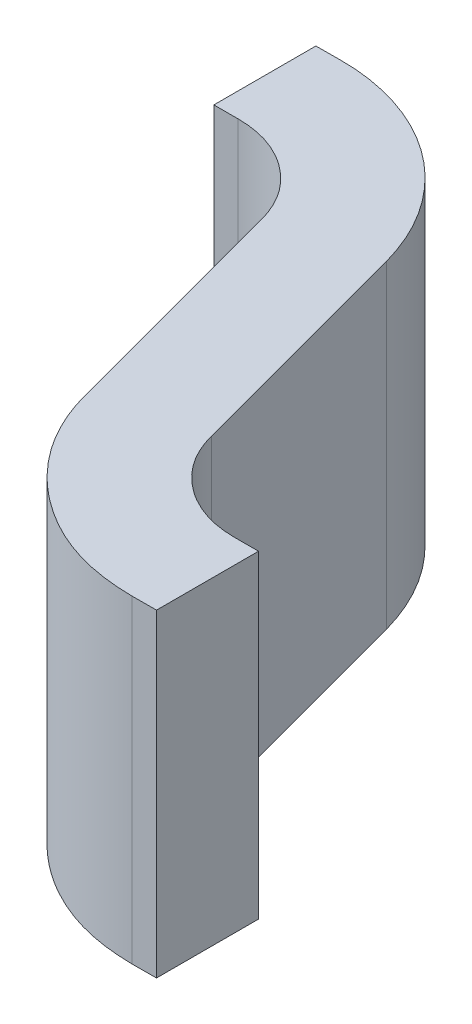
ISO-10303-21;
HEADER;
FILE_DESCRIPTION(('STEP AP214'),'2;1');
FILE_NAME('part.step','',(''),(''),'','','');
FILE_SCHEMA(('AUTOMOTIVE_DESIGN { 1 0 10303 214 1 1 1 1 }'));
ENDSEC;
DATA;
#1=APPLICATION_CONTEXT('core data for automotive mechanical design processes');
#2=APPLICATION_PROTOCOL_DEFINITION('international standard','automotive_design',2000,#1);
#3=PRODUCT_CONTEXT('',#1,'mechanical');
#4=PRODUCT('Part','Part','',(#3));
#5=PRODUCT_RELATED_PRODUCT_CATEGORY('part','',(#4));
#6=PRODUCT_DEFINITION_FORMATION('','',#4);
#7=PRODUCT_DEFINITION_CONTEXT('part definition',#1,'design');
#8=PRODUCT_DEFINITION('design','',#6,#7);
#9=PRODUCT_DEFINITION_SHAPE('','',#8);
#10=(LENGTH_UNIT() NAMED_UNIT(*) SI_UNIT(.MILLI.,.METRE.));
#11=(NAMED_UNIT(*) PLANE_ANGLE_UNIT() SI_UNIT($,.RADIAN.));
#12=(NAMED_UNIT(*) SI_UNIT($,.STERADIAN.) SOLID_ANGLE_UNIT());
#13=UNCERTAINTY_MEASURE_WITH_UNIT(LENGTH_MEASURE(1.E-05),#10,'distance_accuracy_value','');
#14=(GEOMETRIC_REPRESENTATION_CONTEXT(3) GLOBAL_UNCERTAINTY_ASSIGNED_CONTEXT((#13)) GLOBAL_UNIT_ASSIGNED_CONTEXT((#10,
#11,#12)) REPRESENTATION_CONTEXT('',''));
#15=CARTESIAN_POINT('',(0.,0.,0.));
#16=DIRECTION('',(0.,0.,1.));
#17=DIRECTION('',(1.,0.,0.));
#18=AXIS2_PLACEMENT_3D('',#15,#16,#17);
#19=CARTESIAN_POINT('',(-0.673,0.203,0.594));
#20=DIRECTION('',(0.,0.,-1.));
#21=DIRECTION('',(-1.,0.,0.));
#22=AXIS2_PLACEMENT_3D('',#19,#20,#21);
#23=PLANE('',#22);
#24=CARTESIAN_POINT('',(-0.704,-0.203,0.594));
#25=DIRECTION('',(0.,1.,0.));
#26=VECTOR('',#25,1.);
#27=LINE('',#24,#26);
#28=CARTESIAN_POINT('',(-0.704,-0.203,0.5940875));
#29=VERTEX_POINT('',#28);
#30=CARTESIAN_POINT('',(-0.704,0.203,0.5940875));
#31=VERTEX_POINT('',#30);
#32=EDGE_CURVE('E120',#29,#31,#27,.T.);
#33=ORIENTED_EDGE('',*,*,#32,.T.);
#34=DIRECTION('',(1.,0.,0.));
#35=VECTOR('',#34,1.);
#36=CARTESIAN_POINT('',(-0.673,0.203,0.594));
#37=LINE('',#36,#35);
#38=CARTESIAN_POINT('',(-0.673,0.203,0.594));
#39=VERTEX_POINT('',#38);
#40=EDGE_CURVE('E118',#39,#31,#37,.F.);
#41=ORIENTED_EDGE('',*,*,#40,.F.);
#42=DIRECTION('',(0.,1.,0.));
#43=VECTOR('',#42,1.);
#44=CARTESIAN_POINT('',(-0.673,-0.203,0.594));
#45=LINE('',#44,#43);
#46=CARTESIAN_POINT('',(-0.673,-0.203,0.594));
#47=VERTEX_POINT('',#46);
#48=EDGE_CURVE('E105',#47,#39,#45,.T.);
#49=ORIENTED_EDGE('',*,*,#48,.F.);
#50=DIRECTION('',(1.,0.,0.));
#51=VECTOR('',#50,1.);
#52=CARTESIAN_POINT('',(-1.163,-0.203,0.594));
#53=LINE('',#52,#51);
#54=EDGE_CURVE('E231',#29,#47,#53,.T.);
#55=ORIENTED_EDGE('',*,*,#54,.F.);
#56=EDGE_LOOP('',(#33,#41,#49,#55));
#57=FACE_BOUND('',#56,.T.);
#58=ADVANCED_FACE('F17',(#57),#23,.T.);
#59=CARTESIAN_POINT('',(-0.673,-0.203,0.594));
#60=DIRECTION('',(1.,0.,0.));
#61=DIRECTION('',(0.,0.,-1.));
#62=AXIS2_PLACEMENT_3D('',#59,#60,#61);
#63=PLANE('',#62);
#64=DIRECTION('',(0.,1.,0.));
#65=VECTOR('',#64,1.);
#66=CARTESIAN_POINT('',(-0.673,-0.203,0.724));
#67=LINE('',#66,#65);
#68=CARTESIAN_POINT('',(-0.673,-0.203,0.724));
#69=VERTEX_POINT('',#68);
#70=CARTESIAN_POINT('',(-0.673,0.203,0.724));
#71=VERTEX_POINT('',#70);
#72=EDGE_CURVE('E115',#69,#71,#67,.T.);
#73=ORIENTED_EDGE('',*,*,#72,.F.);
#74=DIRECTION('',(0.,0.,-1.));
#75=VECTOR('',#74,1.);
#76=CARTESIAN_POINT('',(-0.673,-0.203,0.13));
#77=LINE('',#76,#75);
#78=EDGE_CURVE('E112',#47,#69,#77,.F.);
#79=ORIENTED_EDGE('',*,*,#78,.F.);
#80=ORIENTED_EDGE('',*,*,#48,.T.);
#81=DIRECTION('',(0.,0.,1.));
#82=VECTOR('',#81,1.);
#83=CARTESIAN_POINT('',(-0.673,0.203,0.594));
#84=LINE('',#83,#82);
#85=EDGE_CURVE('E109',#71,#39,#84,.F.);
#86=ORIENTED_EDGE('',*,*,#85,.F.);
#87=EDGE_LOOP('',(#73,#79,#80,#86));
#88=FACE_BOUND('',#87,.T.);
#89=ADVANCED_FACE('F107',(#88),#63,.T.);
#90=CARTESIAN_POINT('',(-0.673,-0.203,0.724));
#91=DIRECTION('',(0.,0.,1.));
#92=DIRECTION('',(1.,0.,0.));
#93=AXIS2_PLACEMENT_3D('',#90,#91,#92);
#94=PLANE('',#93);
#95=CARTESIAN_POINT('',(-0.704,-0.203,0.72435));
#96=DIRECTION('',(0.,1.,0.));
#97=VECTOR('',#96,1.);
#98=LINE('',#95,#97);
#99=CARTESIAN_POINT('',(-0.704,-0.203,0.724175));
#100=VERTEX_POINT('',#99);
#101=CARTESIAN_POINT('',(-0.704,0.203,0.724175));
#102=VERTEX_POINT('',#101);
#103=EDGE_CURVE('E235',#100,#102,#98,.T.);
#104=ORIENTED_EDGE('',*,*,#103,.F.);
#105=DIRECTION('',(1.,0.,0.));
#106=VECTOR('',#105,1.);
#107=CARTESIAN_POINT('',(-1.163,-0.203,0.724));
#108=LINE('',#107,#106);
#109=EDGE_CURVE('E230',#69,#100,#108,.F.);
#110=ORIENTED_EDGE('',*,*,#109,.F.);
#111=ORIENTED_EDGE('',*,*,#72,.T.);
#112=DIRECTION('',(1.,0.,0.));
#113=VECTOR('',#112,1.);
#114=CARTESIAN_POINT('',(-0.673,0.203,0.724));
#115=LINE('',#114,#113);
#116=EDGE_CURVE('E129',#102,#71,#115,.T.);
#117=ORIENTED_EDGE('',*,*,#116,.F.);
#118=EDGE_LOOP('',(#104,#110,#111,#117));
#119=FACE_BOUND('',#118,.T.);
#120=ADVANCED_FACE('F253',(#119),#94,.T.);
#121=CARTESIAN_POINT('',(-0.704,-0.203,0.464));
#122=DIRECTION('',(0.,-1.,0.));
#123=DIRECTION('',(0.,0.,-1.));
#124=AXIS2_PLACEMENT_3D('',#121,#122,#123);
#125=CYLINDRICAL_SURFACE('',#124,0.26035);
#126=CARTESIAN_POINT('',(-0.955526772155082,-0.203,0.530873120070566));
#127=DIRECTION('',(0.,1.,0.));
#128=VECTOR('',#127,1.);
#129=LINE('',#126,#128);
#130=CARTESIAN_POINT('',(-0.955778048925911,-0.203,0.530940647970098));
#131=VERTEX_POINT('',#130);
#132=CARTESIAN_POINT('',(-0.955778048925911,0.203,0.530940647970098));
#133=VERTEX_POINT('',#132);
#134=EDGE_CURVE('E299',#131,#133,#129,.T.);
#135=ORIENTED_EDGE('',*,*,#134,.F.);
#136=CARTESIAN_POINT('',(-0.704,-0.203,0.724));
#137=CARTESIAN_POINT('',(-0.791951894894089,-0.203,0.724153781472785));
#138=CARTESIAN_POINT('',(-0.862800194597106,-0.203,0.670327244359175));
#139=CARTESIAN_POINT('',(-0.932937770329666,-0.203,0.617040675181758));
#140=CARTESIAN_POINT('',(-0.956,-0.203,0.531));
#141=B_SPLINE_CURVE_WITH_KNOTS('',2,(#136,#137,#138,#139,#140),.UNSPECIFIED.,.F.,.F.,(3,2,3),
(0.,0.5,1.),.UNSPECIFIED.);
#142=EDGE_CURVE('E301',#100,#131,#141,.T.);
#143=ORIENTED_EDGE('',*,*,#142,.F.);
#144=ORIENTED_EDGE('',*,*,#103,.T.);
#145=CARTESIAN_POINT('',(-0.956,0.203,0.531));
#146=CARTESIAN_POINT('',(-0.933229234488758,0.203,0.6159532793229));
#147=CARTESIAN_POINT('',(-0.862800194597106,0.203,0.670327244359175));
#148=CARTESIAN_POINT('',(-0.793077672816363,0.203,0.724155749864565));
#149=CARTESIAN_POINT('',(-0.704,0.203,0.724));
#150=B_SPLINE_CURVE_WITH_KNOTS('',2,(#145,#146,#147,#148,#149),.UNSPECIFIED.,.F.,.F.,(3,2,3),
(0.,0.5,1.),.UNSPECIFIED.);
#151=EDGE_CURVE('E457',#133,#102,#150,.T.);
#152=ORIENTED_EDGE('',*,*,#151,.F.);
#153=EDGE_LOOP('',(#135,#143,#144,#152));
#154=FACE_BOUND('',#153,.T.);
#155=ADVANCED_FACE('F242',(#154),#125,.T.);
#156=CARTESIAN_POINT('',(-1.037,0.203,0.227));
#157=DIRECTION('',(-0.965885549343273,0.,0.258969313954073));
#158=DIRECTION('',(0.258969313954073,0.,0.965885549343273));
#159=AXIS2_PLACEMENT_3D('',#156,#157,#158);
#160=PLANE('',#159);
#161=ORIENTED_EDGE('',*,*,#134,.T.);
#162=CARTESIAN_POINT('',(-1.037,0.203,0.227));
#163=DIRECTION('',(0.257464808361809,0.,0.966287675827037));
#164=VECTOR('',#163,1.);
#165=LINE('',#162,#164);
#166=CARTESIAN_POINT('',(-1.03703616041074,0.203,0.227009470583765));
#167=VERTEX_POINT('',#166);
#168=EDGE_CURVE('E455',#167,#133,#165,.T.);
#169=ORIENTED_EDGE('',*,*,#168,.F.);
#170=CARTESIAN_POINT('',(-1.037,0.203,0.227));
#171=DIRECTION('',(0.,-1.,0.));
#172=VECTOR('',#171,1.);
#173=LINE('',#170,#172);
#174=CARTESIAN_POINT('',(-1.03703616041074,-0.203,0.227009470583765));
#175=VERTEX_POINT('',#174);
#176=EDGE_CURVE('E429',#167,#175,#173,.T.);
#177=ORIENTED_EDGE('',*,*,#176,.T.);
#178=CARTESIAN_POINT('',(-0.956,-0.203,0.531));
#179=DIRECTION('',(-0.257464808361809,0.,-0.966287675827037));
#180=VECTOR('',#179,1.);
#181=LINE('',#178,#180);
#182=EDGE_CURVE('E306',#131,#175,#181,.T.);
#183=ORIENTED_EDGE('',*,*,#182,.F.);
#184=EDGE_LOOP('',(#161,#169,#177,#183));
#185=FACE_BOUND('',#184,.T.);
#186=ADVANCED_FACE('F252',(#185),#160,.T.);
#187=CARTESIAN_POINT('',(-1.163,0.203,0.26));
#188=DIRECTION('',(0.,-1.,0.));
#189=DIRECTION('',(0.,0.,-1.));
#190=AXIS2_PLACEMENT_3D('',#187,#188,#189);
#191=CYLINDRICAL_SURFACE('',#190,0.130175);
#192=CARTESIAN_POINT('',(-1.037,-0.203,0.227));
#193=CARTESIAN_POINT('',(-1.04820734245524,-0.203,0.184337873813478));
#194=CARTESIAN_POINT('',(-1.0834429661774,-0.203,0.156992982158839));
#195=CARTESIAN_POINT('',(-1.11832539944349,-0.203,0.129922186823055));
#196=CARTESIAN_POINT('',(-1.163,-0.203,0.13));
#197=B_SPLINE_CURVE_WITH_KNOTS('',2,(#192,#193,#194,#195,#196),.UNSPECIFIED.,.F.,.F.,(3,2,3),
(0.,0.5,1.),.UNSPECIFIED.);
#198=CARTESIAN_POINT('',(-1.163,-0.203,0.1299125));
#199=VERTEX_POINT('',#198);
#200=EDGE_CURVE('E369',#175,#199,#197,.T.);
#201=ORIENTED_EDGE('',*,*,#200,.F.);
#202=ORIENTED_EDGE('',*,*,#176,.F.);
#203=CARTESIAN_POINT('',(-1.163,0.203,0.13));
#204=CARTESIAN_POINT('',(-1.11889035866824,0.203,0.129923170855851));
#205=CARTESIAN_POINT('',(-1.0834429661774,0.203,0.156992982158839));
#206=CARTESIAN_POINT('',(-1.04835088684404,0.203,0.183791454459135));
#207=CARTESIAN_POINT('',(-1.037,0.203,0.227));
#208=B_SPLINE_CURVE_WITH_KNOTS('',2,(#203,#204,#205,#206,#207),.UNSPECIFIED.,.F.,.F.,(3,2,3),
(0.,0.5,1.),.UNSPECIFIED.);
#209=CARTESIAN_POINT('',(-1.163,0.203,0.1299125));
#210=VERTEX_POINT('',#209);
#211=EDGE_CURVE('E461',#210,#167,#208,.T.);
#212=ORIENTED_EDGE('',*,*,#211,.F.);
#213=CARTESIAN_POINT('',(-1.163,-0.203,0.13));
#214=DIRECTION('',(0.,1.,0.));
#215=VECTOR('',#214,1.);
#216=LINE('',#213,#215);
#217=EDGE_CURVE('E474',#199,#210,#216,.T.);
#218=ORIENTED_EDGE('',*,*,#217,.F.);
#219=EDGE_LOOP('',(#201,#202,#212,#218));
#220=FACE_BOUND('',#219,.T.);
#221=ADVANCED_FACE('F397',(#220),#191,.F.);
#222=CARTESIAN_POINT('',(-1.194,0.203,0.13));
#223=DIRECTION('',(0.,0.,1.));
#224=DIRECTION('',(1.,0.,0.));
#225=AXIS2_PLACEMENT_3D('',#222,#223,#224);
#226=PLANE('',#225);
#227=ORIENTED_EDGE('',*,*,#217,.T.);
#228=DIRECTION('',(1.,0.,0.));
#229=VECTOR('',#228,1.);
#230=CARTESIAN_POINT('',(-0.673,0.203,0.13));
#231=LINE('',#230,#229);
#232=CARTESIAN_POINT('',(-1.194,0.203,0.13));
#233=VERTEX_POINT('',#232);
#234=EDGE_CURVE('E475',#233,#210,#231,.T.);
#235=ORIENTED_EDGE('',*,*,#234,.F.);
#236=DIRECTION('',(0.,1.,0.));
#237=VECTOR('',#236,1.);
#238=CARTESIAN_POINT('',(-1.194,0.203,0.13));
#239=LINE('',#238,#237);
#240=CARTESIAN_POINT('',(-1.194,-0.203,0.13));
#241=VERTEX_POINT('',#240);
#242=EDGE_CURVE('E533',#241,#233,#239,.T.);
#243=ORIENTED_EDGE('',*,*,#242,.F.);
#244=DIRECTION('',(1.,0.,0.));
#245=VECTOR('',#244,1.);
#246=CARTESIAN_POINT('',(-1.163,-0.203,0.13));
#247=LINE('',#246,#245);
#248=EDGE_CURVE('E361',#199,#241,#247,.F.);
#249=ORIENTED_EDGE('',*,*,#248,.F.);
#250=EDGE_LOOP('',(#227,#235,#243,#249));
#251=FACE_BOUND('',#250,.T.);
#252=ADVANCED_FACE('F405',(#251),#226,.T.);
#253=CARTESIAN_POINT('',(-1.194,0.203,0.));
#254=DIRECTION('',(-1.,0.,0.));
#255=DIRECTION('',(0.,0.,1.));
#256=AXIS2_PLACEMENT_3D('',#253,#254,#255);
#257=PLANE('',#256);
#258=ORIENTED_EDGE('',*,*,#242,.T.);
#259=DIRECTION('',(0.,0.,1.));
#260=VECTOR('',#259,1.);
#261=CARTESIAN_POINT('',(-1.194,0.203,0.594));
#262=LINE('',#261,#260);
#263=CARTESIAN_POINT('',(-1.194,0.203,0.));
#264=VERTEX_POINT('',#263);
#265=EDGE_CURVE('E480',#264,#233,#262,.T.);
#266=ORIENTED_EDGE('',*,*,#265,.F.);
#267=DIRECTION('',(0.,1.,0.));
#268=VECTOR('',#267,1.);
#269=CARTESIAN_POINT('',(-1.194,0.203,0.));
#270=LINE('',#269,#268);
#271=CARTESIAN_POINT('',(-1.194,-0.203,0.));
#272=VERTEX_POINT('',#271);
#273=EDGE_CURVE('E131',#272,#264,#270,.T.);
#274=ORIENTED_EDGE('',*,*,#273,.F.);
#275=DIRECTION('',(0.,0.,-1.));
#276=VECTOR('',#275,1.);
#277=CARTESIAN_POINT('',(-1.194,-0.203,0.13));
#278=LINE('',#277,#276);
#279=EDGE_CURVE('E358',#241,#272,#278,.T.);
#280=ORIENTED_EDGE('',*,*,#279,.F.);
#281=EDGE_LOOP('',(#258,#266,#274,#280));
#282=FACE_BOUND('',#281,.T.);
#283=ADVANCED_FACE('F159',(#282),#257,.T.);
#284=CARTESIAN_POINT('',(-0.704,0.203,0.464));
#285=DIRECTION('',(0.,-1.,0.));
#286=DIRECTION('',(0.,0.,-1.));
#287=AXIS2_PLACEMENT_3D('',#284,#285,#286);
#288=CYLINDRICAL_SURFACE('',#287,0.130175);
#289=CARTESIAN_POINT('',(-0.83,-0.203,0.497));
#290=CARTESIAN_POINT('',(-0.818792657544766,-0.203,0.5396621261865));
#291=CARTESIAN_POINT('',(-0.783557033822601,-0.203,0.567007017841161));
#292=CARTESIAN_POINT('',(-0.748674600556537,-0.203,0.594077813176945));
#293=CARTESIAN_POINT('',(-0.704,-0.203,0.594));
#294=B_SPLINE_CURVE_WITH_KNOTS('',2,(#289,#290,#291,#292,#293),.UNSPECIFIED.,.F.,.F.,(3,2,3),
(0.,0.5,1.),.UNSPECIFIED.);
#295=CARTESIAN_POINT('',(-0.829749785995496,-0.203,0.496932998109982));
#296=VERTEX_POINT('',#295);
#297=EDGE_CURVE('E355',#296,#29,#294,.T.);
#298=ORIENTED_EDGE('',*,*,#297,.F.);
#299=CARTESIAN_POINT('',(-0.829526772155082,0.203,0.496873120070566));
#300=DIRECTION('',(0.,-1.,0.));
#301=VECTOR('',#300,1.);
#302=LINE('',#299,#301);
#303=CARTESIAN_POINT('',(-0.829742009159968,0.203,0.496930961319137));
#304=VERTEX_POINT('',#303);
#305=EDGE_CURVE('E224',#304,#296,#302,.T.);
#306=ORIENTED_EDGE('',*,*,#305,.F.);
#307=CARTESIAN_POINT('',(-0.704,0.203,0.594));
#308=CARTESIAN_POINT('',(-0.748109641331749,0.203,0.594076829144149));
#309=CARTESIAN_POINT('',(-0.783557033822601,0.203,0.567007017841161));
#310=CARTESIAN_POINT('',(-0.818649113155959,0.203,0.540208545540874));
#311=CARTESIAN_POINT('',(-0.83,0.203,0.497));
#312=B_SPLINE_CURVE_WITH_KNOTS('',2,(#307,#308,#309,#310,#311),.UNSPECIFIED.,.F.,.F.,(3,2,3),
(0.,0.5,1.),.UNSPECIFIED.);
#313=EDGE_CURVE('E124',#31,#304,#312,.T.);
#314=ORIENTED_EDGE('',*,*,#313,.F.);
#315=ORIENTED_EDGE('',*,*,#32,.F.);
#316=EDGE_LOOP('',(#298,#306,#314,#315));
#317=FACE_BOUND('',#316,.T.);
#318=ADVANCED_FACE('F148',(#317),#288,.F.);
#319=CARTESIAN_POINT('',(-1.163,0.203,0.));
#320=DIRECTION('',(0.,0.,-1.));
#321=DIRECTION('',(-1.,0.,0.));
#322=AXIS2_PLACEMENT_3D('',#319,#320,#321);
#323=PLANE('',#322);
#324=ORIENTED_EDGE('',*,*,#273,.T.);
#325=DIRECTION('',(1.,0.,0.));
#326=VECTOR('',#325,1.);
#327=CARTESIAN_POINT('',(-0.673,0.203,0.));
#328=LINE('',#327,#326);
#329=CARTESIAN_POINT('',(-1.163,0.203,-0.000174999999999991));
#330=VERTEX_POINT('',#329);
#331=EDGE_CURVE('E483',#330,#264,#328,.F.);
#332=ORIENTED_EDGE('',*,*,#331,.F.);
#333=CARTESIAN_POINT('',(-1.163,-0.203,-0.000349999999999981));
#334=DIRECTION('',(0.,1.,0.));
#335=VECTOR('',#334,1.);
#336=LINE('',#333,#335);
#337=CARTESIAN_POINT('',(-1.163,-0.203,-0.000174999999999991));
#338=VERTEX_POINT('',#337);
#339=EDGE_CURVE('E349',#338,#330,#336,.T.);
#340=ORIENTED_EDGE('',*,*,#339,.F.);
#341=DIRECTION('',(1.,0.,0.));
#342=VECTOR('',#341,1.);
#343=CARTESIAN_POINT('',(-1.163,-0.203,0.));
#344=LINE('',#343,#342);
#345=EDGE_CURVE('E357',#272,#338,#344,.T.);
#346=ORIENTED_EDGE('',*,*,#345,.F.);
#347=EDGE_LOOP('',(#324,#332,#340,#346));
#348=FACE_BOUND('',#347,.T.);
#349=ADVANCED_FACE('F158',(#348),#323,.T.);
#350=CARTESIAN_POINT('',(-0.673,0.203,0.594));
#351=DIRECTION('',(0.,1.,0.));
#352=DIRECTION('',(0.,0.,1.));
#353=AXIS2_PLACEMENT_3D('',#350,#351,#352);
#354=PLANE('',#353);
#355=ORIENTED_EDGE('',*,*,#168,.T.);
#356=ORIENTED_EDGE('',*,*,#151,.T.);
#357=ORIENTED_EDGE('',*,*,#116,.T.);
#358=ORIENTED_EDGE('',*,*,#85,.T.);
#359=ORIENTED_EDGE('',*,*,#40,.T.);
#360=ORIENTED_EDGE('',*,*,#313,.T.);
#361=CARTESIAN_POINT('',(-0.911,0.203,0.193));
#362=DIRECTION('',(0.258969313954073,0.,0.965885549343273));
#363=VECTOR('',#362,1.);
#364=LINE('',#361,#363);
#365=CARTESIAN_POINT('',(-0.911195543650738,0.203,0.193051989780157));
#366=VERTEX_POINT('',#365);
#367=EDGE_CURVE('E184',#366,#304,#364,.T.);
#368=ORIENTED_EDGE('',*,*,#367,.F.);
#369=CARTESIAN_POINT('',(-1.163,0.203,0.26));
#370=DIRECTION('',(0.,-1.,0.));
#371=DIRECTION('',(0.,0.,-1.));
#372=AXIS2_PLACEMENT_3D('',#369,#370,#371);
#373=CIRCLE('',#372,0.26035);
#374=EDGE_CURVE('E351',#330,#366,#373,.T.);
#375=ORIENTED_EDGE('',*,*,#374,.F.);
#376=ORIENTED_EDGE('',*,*,#331,.T.);
#377=ORIENTED_EDGE('',*,*,#265,.T.);
#378=ORIENTED_EDGE('',*,*,#234,.T.);
#379=ORIENTED_EDGE('',*,*,#211,.T.);
#380=EDGE_LOOP('',(#355,#356,#357,#358,#359,#360,#368,#375,#376,#377,#378,#379));
#381=FACE_BOUND('',#380,.T.);
#382=ADVANCED_FACE('F127',(#381),#354,.T.);
#383=CARTESIAN_POINT('',(-0.911,-0.203,0.193));
#384=DIRECTION('',(0.965885549343273,0.,-0.258969313954073));
#385=DIRECTION('',(-0.258969313954073,0.,-0.965885549343273));
#386=AXIS2_PLACEMENT_3D('',#383,#384,#385);
#387=PLANE('',#386);
#388=ORIENTED_EDGE('',*,*,#305,.T.);
#389=CARTESIAN_POINT('',(-0.911,-0.203,0.193));
#390=DIRECTION('',(0.257464808361809,0.,0.966287675827037));
#391=VECTOR('',#390,1.);
#392=LINE('',#389,#391);
#393=CARTESIAN_POINT('',(-0.911195543650739,-0.203,0.193051989780157));
#394=VERTEX_POINT('',#393);
#395=EDGE_CURVE('E35',#394,#296,#392,.T.);
#396=ORIENTED_EDGE('',*,*,#395,.F.);
#397=CARTESIAN_POINT('',(-0.911391087301477,0.203,0.193103979560313));
#398=DIRECTION('',(0.,-1.,0.));
#399=VECTOR('',#398,1.);
#400=LINE('',#397,#399);
#401=EDGE_CURVE('E27',#366,#394,#400,.T.);
#402=ORIENTED_EDGE('',*,*,#401,.F.);
#403=ORIENTED_EDGE('',*,*,#367,.T.);
#404=EDGE_LOOP('',(#388,#396,#402,#403));
#405=FACE_BOUND('',#404,.T.);
#406=ADVANCED_FACE('F190',(#405),#387,.T.);
#407=CARTESIAN_POINT('',(-1.163,-0.203,0.13));
#408=DIRECTION('',(0.,-1.,0.));
#409=DIRECTION('',(0.,0.,-1.));
#410=AXIS2_PLACEMENT_3D('',#407,#408,#409);
#411=PLANE('',#410);
#412=ORIENTED_EDGE('',*,*,#395,.T.);
#413=ORIENTED_EDGE('',*,*,#297,.T.);
#414=ORIENTED_EDGE('',*,*,#54,.T.);
#415=ORIENTED_EDGE('',*,*,#78,.T.);
#416=ORIENTED_EDGE('',*,*,#109,.T.);
#417=ORIENTED_EDGE('',*,*,#142,.T.);
#418=ORIENTED_EDGE('',*,*,#182,.T.);
#419=ORIENTED_EDGE('',*,*,#200,.T.);
#420=ORIENTED_EDGE('',*,*,#248,.T.);
#421=ORIENTED_EDGE('',*,*,#279,.T.);
#422=ORIENTED_EDGE('',*,*,#345,.T.);
#423=CARTESIAN_POINT('',(-1.163,-0.203,0.26));
#424=DIRECTION('',(0.,-1.,0.));
#425=DIRECTION('',(0.,0.,-1.));
#426=AXIS2_PLACEMENT_3D('',#423,#424,#425);
#427=CIRCLE('',#426,0.26035);
#428=EDGE_CURVE('E11',#394,#338,#427,.F.);
#429=ORIENTED_EDGE('',*,*,#428,.F.);
#430=EDGE_LOOP('',(#412,#413,#414,#415,#416,#417,#418,#419,#420,#421,#422,#429));
#431=FACE_BOUND('',#430,.T.);
#432=ADVANCED_FACE('F199',(#431),#411,.T.);
#433=CARTESIAN_POINT('',(-1.163,0.203,0.26));
#434=DIRECTION('',(0.,-1.,0.));
#435=DIRECTION('',(0.,0.,-1.));
#436=AXIS2_PLACEMENT_3D('',#433,#434,#435);
#437=CYLINDRICAL_SURFACE('',#436,0.26035);
#438=ORIENTED_EDGE('',*,*,#401,.T.);
#439=ORIENTED_EDGE('',*,*,#428,.T.);
#440=ORIENTED_EDGE('',*,*,#339,.T.);
#441=ORIENTED_EDGE('',*,*,#374,.T.);
#442=EDGE_LOOP('',(#438,#439,#440,#441));
#443=FACE_BOUND('',#442,.T.);
#444=ADVANCED_FACE('F323',(#443),#437,.T.);
#445=CLOSED_SHELL('',(#58,#89,#120,#155,#186,#221,#252,#283,#318,#349,#382,#406,#432,#444));
#446=MANIFOLD_SOLID_BREP('B1',#445);
#447=ADVANCED_BREP_SHAPE_REPRESENTATION('',(#18,#446),#14);
#448=SHAPE_DEFINITION_REPRESENTATION(#9,#447);
ENDSEC;
END-ISO-10303-21;
